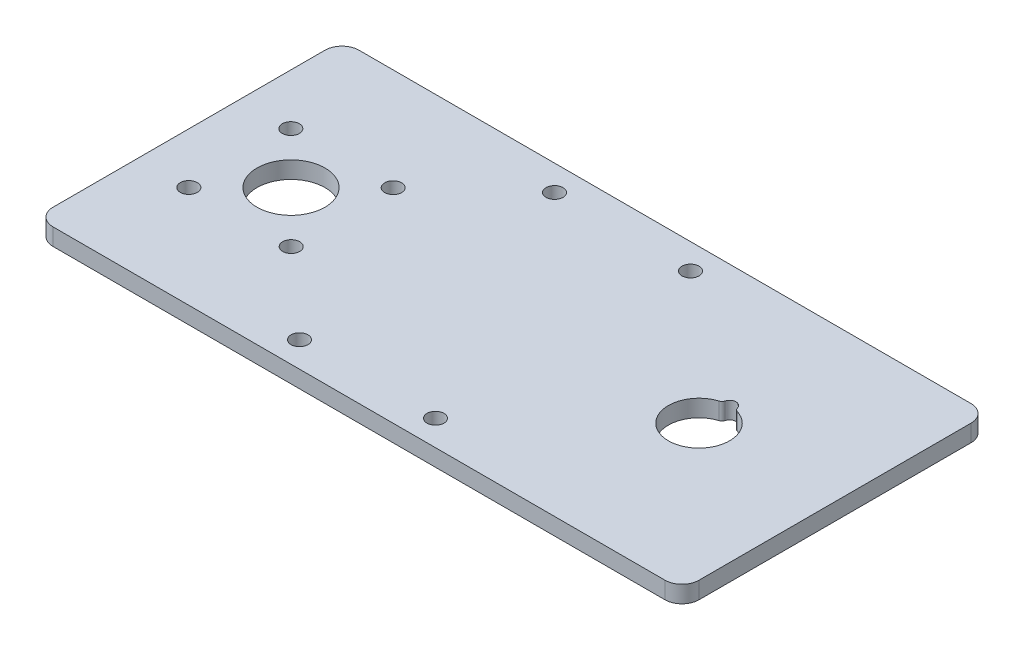
ISO-10303-21;
HEADER;
FILE_DESCRIPTION(('STEP AP214'),'2;1');
FILE_NAME('part.step','',(''),(''),'','','');
FILE_SCHEMA(('AUTOMOTIVE_DESIGN { 1 0 10303 214 1 1 1 1 }'));
ENDSEC;
DATA;
#1=APPLICATION_CONTEXT('core data for automotive mechanical design processes');
#2=APPLICATION_PROTOCOL_DEFINITION('international standard','automotive_design',2000,#1);
#3=PRODUCT_CONTEXT('',#1,'mechanical');
#4=PRODUCT('Part','Part','',(#3));
#5=PRODUCT_RELATED_PRODUCT_CATEGORY('part','',(#4));
#6=PRODUCT_DEFINITION_FORMATION('','',#4);
#7=PRODUCT_DEFINITION_CONTEXT('part definition',#1,'design');
#8=PRODUCT_DEFINITION('design','',#6,#7);
#9=PRODUCT_DEFINITION_SHAPE('','',#8);
#10=(LENGTH_UNIT() NAMED_UNIT(*) SI_UNIT(.MILLI.,.METRE.));
#11=(NAMED_UNIT(*) PLANE_ANGLE_UNIT() SI_UNIT($,.RADIAN.));
#12=(NAMED_UNIT(*) SI_UNIT($,.STERADIAN.) SOLID_ANGLE_UNIT());
#13=UNCERTAINTY_MEASURE_WITH_UNIT(LENGTH_MEASURE(1.E-05),#10,'distance_accuracy_value','');
#14=(GEOMETRIC_REPRESENTATION_CONTEXT(3) GLOBAL_UNCERTAINTY_ASSIGNED_CONTEXT((#13)) GLOBAL_UNIT_ASSIGNED_CONTEXT((#10,
#11,#12)) REPRESENTATION_CONTEXT('',''));
#15=CARTESIAN_POINT('',(0.,0.,0.));
#16=DIRECTION('',(0.,0.,1.));
#17=DIRECTION('',(1.,0.,0.));
#18=AXIS2_PLACEMENT_3D('',#15,#16,#17);
#19=CARTESIAN_POINT('',(0.,6.35,0.));
#20=DIRECTION('',(0.,-1.,0.));
#21=DIRECTION('',(0.,0.,-1.));
#22=AXIS2_PLACEMENT_3D('',#19,#20,#21);
#23=PLANE('',#22);
#24=CARTESIAN_POINT('',(57.2160313938328,6.35,-76.2));
#25=DIRECTION('',(0.,1.,0.));
#26=DIRECTION('',(0.,0.,1.));
#27=AXIS2_PLACEMENT_3D('',#24,#25,#26);
#28=CIRCLE('',#27,3.175);
#29=CARTESIAN_POINT('',(57.2160313938328,6.35,-73.025));
#30=VERTEX_POINT('',#29);
#31=EDGE_CURVE('E257',#30,#30,#28,.T.);
#32=ORIENTED_EDGE('',*,*,#31,.F.);
#33=EDGE_LOOP('',(#32));
#34=FACE_BOUND('',#33,.T.);
#35=CARTESIAN_POINT('',(57.2160313938328,6.35,-38.1));
#36=DIRECTION('',(0.,1.,0.));
#37=DIRECTION('',(0.,0.,1.));
#38=AXIS2_PLACEMENT_3D('',#35,#36,#37);
#39=CIRCLE('',#38,3.175);
#40=CARTESIAN_POINT('',(57.2160313938328,6.35,-34.925));
#41=VERTEX_POINT('',#40);
#42=EDGE_CURVE('E266',#41,#41,#39,.T.);
#43=ORIENTED_EDGE('',*,*,#42,.F.);
#44=EDGE_LOOP('',(#43));
#45=FACE_BOUND('',#44,.T.);
#46=CARTESIAN_POINT('',(18.9839686061672,6.35,-38.1));
#47=DIRECTION('',(0.,1.,0.));
#48=DIRECTION('',(0.,0.,1.));
#49=AXIS2_PLACEMENT_3D('',#46,#47,#48);
#50=CIRCLE('',#49,3.175);
#51=CARTESIAN_POINT('',(18.9839686061672,6.35,-34.925));
#52=VERTEX_POINT('',#51);
#53=EDGE_CURVE('E274',#52,#52,#50,.T.);
#54=ORIENTED_EDGE('',*,*,#53,.F.);
#55=EDGE_LOOP('',(#54));
#56=FACE_BOUND('',#55,.T.);
#57=CARTESIAN_POINT('',(18.9839686061672,6.35,-76.2));
#58=DIRECTION('',(0.,1.,0.));
#59=DIRECTION('',(0.,0.,1.));
#60=AXIS2_PLACEMENT_3D('',#57,#58,#59);
#61=CIRCLE('',#60,3.175);
#62=CARTESIAN_POINT('',(18.9839686061672,6.35,-73.025));
#63=VERTEX_POINT('',#62);
#64=EDGE_CURVE('E282',#63,#63,#61,.T.);
#65=ORIENTED_EDGE('',*,*,#64,.F.);
#66=EDGE_LOOP('',(#65));
#67=FACE_BOUND('',#66,.T.);
#68=CARTESIAN_POINT('',(88.9,6.35,-9.525));
#69=DIRECTION('',(0.,1.,0.));
#70=DIRECTION('',(0.,0.,1.));
#71=AXIS2_PLACEMENT_3D('',#68,#69,#70);
#72=CIRCLE('',#71,3.175);
#73=CARTESIAN_POINT('',(88.9,6.35,-6.35));
#74=VERTEX_POINT('',#73);
#75=EDGE_CURVE('E290',#74,#74,#72,.T.);
#76=ORIENTED_EDGE('',*,*,#75,.F.);
#77=EDGE_LOOP('',(#76));
#78=FACE_BOUND('',#77,.T.);
#79=CARTESIAN_POINT('',(139.7,6.35,-9.525));
#80=DIRECTION('',(0.,1.,0.));
#81=DIRECTION('',(0.,0.,1.));
#82=AXIS2_PLACEMENT_3D('',#79,#80,#81);
#83=CIRCLE('',#82,3.175);
#84=CARTESIAN_POINT('',(139.7,6.35,-6.35));
#85=VERTEX_POINT('',#84);
#86=EDGE_CURVE('E298',#85,#85,#83,.T.);
#87=ORIENTED_EDGE('',*,*,#86,.F.);
#88=EDGE_LOOP('',(#87));
#89=FACE_BOUND('',#88,.T.);
#90=CARTESIAN_POINT('',(139.7,6.35,-104.775));
#91=DIRECTION('',(0.,1.,0.));
#92=DIRECTION('',(0.,0.,1.));
#93=AXIS2_PLACEMENT_3D('',#90,#91,#92);
#94=CIRCLE('',#93,3.17499999999997);
#95=CARTESIAN_POINT('',(139.7,6.35,-101.6));
#96=VERTEX_POINT('',#95);
#97=EDGE_CURVE('E306',#96,#96,#94,.T.);
#98=ORIENTED_EDGE('',*,*,#97,.F.);
#99=EDGE_LOOP('',(#98));
#100=FACE_BOUND('',#99,.T.);
#101=CARTESIAN_POINT('',(88.9,6.35,-104.775));
#102=DIRECTION('',(0.,1.,0.));
#103=DIRECTION('',(0.,0.,1.));
#104=AXIS2_PLACEMENT_3D('',#101,#102,#103);
#105=CIRCLE('',#104,3.175);
#106=CARTESIAN_POINT('',(88.9,6.35,-101.6));
#107=VERTEX_POINT('',#106);
#108=EDGE_CURVE('E314',#107,#107,#105,.T.);
#109=ORIENTED_EDGE('',*,*,#108,.F.);
#110=EDGE_LOOP('',(#109));
#111=FACE_BOUND('',#110,.T.);
#112=CARTESIAN_POINT('',(38.1,6.35,-57.15));
#113=DIRECTION('',(0.,1.,0.));
#114=DIRECTION('',(0.,0.,1.));
#115=AXIS2_PLACEMENT_3D('',#112,#113,#114);
#116=CIRCLE('',#115,12.7);
#117=CARTESIAN_POINT('',(38.1,6.35,-44.45));
#118=VERTEX_POINT('',#117);
#119=EDGE_CURVE('E162',#118,#118,#116,.T.);
#120=ORIENTED_EDGE('',*,*,#119,.F.);
#121=EDGE_LOOP('',(#120));
#122=FACE_BOUND('',#121,.T.);
#123=DIRECTION('',(-1.,0.,0.));
#124=VECTOR('',#123,1.);
#125=CARTESIAN_POINT('',(0.,6.35,-114.3));
#126=LINE('',#125,#124);
#127=CARTESIAN_POINT('',(234.95,6.35,-114.3));
#128=VERTEX_POINT('',#127);
#129=CARTESIAN_POINT('',(6.35,6.35,-114.3));
#130=VERTEX_POINT('',#129);
#131=EDGE_CURVE('E174',#128,#130,#126,.T.);
#132=ORIENTED_EDGE('',*,*,#131,.T.);
#133=CARTESIAN_POINT('',(6.35,6.35,-107.95));
#134=DIRECTION('',(0.,-1.,0.));
#135=DIRECTION('',(0.,0.,-1.));
#136=AXIS2_PLACEMENT_3D('',#133,#134,#135);
#137=CIRCLE('',#136,6.35);
#138=CARTESIAN_POINT('',(0.,6.35,-107.95));
#139=VERTEX_POINT('',#138);
#140=EDGE_CURVE('E206',#130,#139,#137,.F.);
#141=ORIENTED_EDGE('',*,*,#140,.T.);
#142=DIRECTION('',(0.,0.,1.));
#143=VECTOR('',#142,1.);
#144=CARTESIAN_POINT('',(0.,6.35,0.));
#145=LINE('',#144,#143);
#146=CARTESIAN_POINT('',(0.,6.35,-6.35));
#147=VERTEX_POINT('',#146);
#148=EDGE_CURVE('E152',#139,#147,#145,.T.);
#149=ORIENTED_EDGE('',*,*,#148,.T.);
#150=CARTESIAN_POINT('',(6.35,6.35,-6.35));
#151=DIRECTION('',(0.,-1.,0.));
#152=DIRECTION('',(0.,0.,-1.));
#153=AXIS2_PLACEMENT_3D('',#150,#151,#152);
#154=CIRCLE('',#153,6.35);
#155=CARTESIAN_POINT('',(6.35,6.35,0.));
#156=VERTEX_POINT('',#155);
#157=EDGE_CURVE('E197',#147,#156,#154,.F.);
#158=ORIENTED_EDGE('',*,*,#157,.T.);
#159=DIRECTION('',(1.,0.,0.));
#160=VECTOR('',#159,1.);
#161=CARTESIAN_POINT('',(0.,6.35,0.));
#162=LINE('',#161,#160);
#163=CARTESIAN_POINT('',(234.95,6.35,0.));
#164=VERTEX_POINT('',#163);
#165=EDGE_CURVE('E326',#156,#164,#162,.T.);
#166=ORIENTED_EDGE('',*,*,#165,.T.);
#167=CARTESIAN_POINT('',(234.95,6.35,-6.35));
#168=DIRECTION('',(0.,-1.,0.));
#169=DIRECTION('',(0.,0.,-1.));
#170=AXIS2_PLACEMENT_3D('',#167,#168,#169);
#171=CIRCLE('',#170,6.35);
#172=CARTESIAN_POINT('',(241.3,6.35,-6.35));
#173=VERTEX_POINT('',#172);
#174=EDGE_CURVE('E200',#164,#173,#171,.F.);
#175=ORIENTED_EDGE('',*,*,#174,.T.);
#176=DIRECTION('',(0.,0.,-1.));
#177=VECTOR('',#176,1.);
#178=CARTESIAN_POINT('',(241.3,6.35,0.));
#179=LINE('',#178,#177);
#180=CARTESIAN_POINT('',(241.3,6.35,-107.95));
#181=VERTEX_POINT('',#180);
#182=EDGE_CURVE('E329',#173,#181,#179,.T.);
#183=ORIENTED_EDGE('',*,*,#182,.T.);
#184=CARTESIAN_POINT('',(234.95,6.35,-107.95));
#185=DIRECTION('',(0.,-1.,0.));
#186=DIRECTION('',(0.,0.,-1.));
#187=AXIS2_PLACEMENT_3D('',#184,#185,#186);
#188=CIRCLE('',#187,6.35);
#189=EDGE_CURVE('E203',#181,#128,#188,.F.);
#190=ORIENTED_EDGE('',*,*,#189,.T.);
#191=EDGE_LOOP('',(#132,#141,#149,#158,#166,#175,#183,#190));
#192=FACE_BOUND('',#191,.T.);
#193=CARTESIAN_POINT('',(190.5,6.35,-57.15));
#194=DIRECTION('',(0.,1.,0.));
#195=DIRECTION('',(0.,0.,1.));
#196=AXIS2_PLACEMENT_3D('',#193,#194,#195);
#197=CIRCLE('',#196,11.43);
#198=CARTESIAN_POINT('',(187.129681779469,6.35,-68.071806402439));
#199=VERTEX_POINT('',#198);
#200=CARTESIAN_POINT('',(193.870318220531,6.35,-68.071806402439));
#201=VERTEX_POINT('',#200);
#202=EDGE_CURVE('E239',#199,#201,#197,.T.);
#203=ORIENTED_EDGE('',*,*,#202,.F.);
#204=CARTESIAN_POINT('',(186.661582026618,6.35,-69.5887239583333));
#205=DIRECTION('',(0.,-1.,0.));
#206=DIRECTION('',(0.,0.,-1.));
#207=AXIS2_PLACEMENT_3D('',#204,#205,#206);
#208=CIRCLE('',#207,1.5875);
#209=CARTESIAN_POINT('',(188.196949215971,6.35,-69.185234375));
#210=VERTEX_POINT('',#209);
#211=EDGE_CURVE('E11',#199,#210,#208,.F.);
#212=ORIENTED_EDGE('',*,*,#211,.T.);
#213=CARTESIAN_POINT('',(190.5,6.35,-68.58));
#214=DIRECTION('',(0.,1.,0.));
#215=DIRECTION('',(0.,0.,1.));
#216=AXIS2_PLACEMENT_3D('',#213,#214,#215);
#217=CIRCLE('',#216,2.38125);
#218=CARTESIAN_POINT('',(192.803050784029,6.35,-69.185234375));
#219=VERTEX_POINT('',#218);
#220=EDGE_CURVE('E245',#219,#210,#217,.T.);
#221=ORIENTED_EDGE('',*,*,#220,.F.);
#222=CARTESIAN_POINT('',(194.338417973382,6.35,-69.5887239583333));
#223=DIRECTION('',(0.,-1.,0.));
#224=DIRECTION('',(0.,0.,-1.));
#225=AXIS2_PLACEMENT_3D('',#222,#223,#224);
#226=CIRCLE('',#225,1.5875);
#227=EDGE_CURVE('E50',#219,#201,#226,.F.);
#228=ORIENTED_EDGE('',*,*,#227,.T.);
#229=EDGE_LOOP('',(#203,#212,#221,#228));
#230=FACE_BOUND('',#229,.T.);
#231=ADVANCED_FACE('F42',(#34,#45,#56,#67,#78,#89,#100,#111,#122,#192,#230),#23,.F.);
#232=CARTESIAN_POINT('',(0.,0.,0.));
#233=DIRECTION('',(0.,-1.,0.));
#234=DIRECTION('',(0.,0.,-1.));
#235=AXIS2_PLACEMENT_3D('',#232,#233,#234);
#236=PLANE('',#235);
#237=CARTESIAN_POINT('',(57.2160313938328,0.,-38.1));
#238=DIRECTION('',(0.,1.,0.));
#239=DIRECTION('',(0.,0.,1.));
#240=AXIS2_PLACEMENT_3D('',#237,#238,#239);
#241=CIRCLE('',#240,3.175);
#242=CARTESIAN_POINT('',(57.2160313938328,0.,-34.925));
#243=VERTEX_POINT('',#242);
#244=EDGE_CURVE('E261',#243,#243,#241,.T.);
#245=ORIENTED_EDGE('',*,*,#244,.T.);
#246=EDGE_LOOP('',(#245));
#247=FACE_BOUND('',#246,.T.);
#248=CARTESIAN_POINT('',(18.9839686061672,0.,-76.2));
#249=DIRECTION('',(0.,1.,0.));
#250=DIRECTION('',(0.,0.,1.));
#251=AXIS2_PLACEMENT_3D('',#248,#249,#250);
#252=CIRCLE('',#251,3.175);
#253=CARTESIAN_POINT('',(18.9839686061672,0.,-73.025));
#254=VERTEX_POINT('',#253);
#255=EDGE_CURVE('E278',#254,#254,#252,.T.);
#256=ORIENTED_EDGE('',*,*,#255,.T.);
#257=EDGE_LOOP('',(#256));
#258=FACE_BOUND('',#257,.T.);
#259=CARTESIAN_POINT('',(139.7,0.,-9.525));
#260=DIRECTION('',(0.,1.,0.));
#261=DIRECTION('',(0.,0.,1.));
#262=AXIS2_PLACEMENT_3D('',#259,#260,#261);
#263=CIRCLE('',#262,3.175);
#264=CARTESIAN_POINT('',(139.7,0.,-6.35));
#265=VERTEX_POINT('',#264);
#266=EDGE_CURVE('E294',#265,#265,#263,.T.);
#267=ORIENTED_EDGE('',*,*,#266,.T.);
#268=EDGE_LOOP('',(#267));
#269=FACE_BOUND('',#268,.T.);
#270=CARTESIAN_POINT('',(88.9,0.,-104.775));
#271=DIRECTION('',(0.,1.,0.));
#272=DIRECTION('',(0.,0.,1.));
#273=AXIS2_PLACEMENT_3D('',#270,#271,#272);
#274=CIRCLE('',#273,3.175);
#275=CARTESIAN_POINT('',(88.9,0.,-101.6));
#276=VERTEX_POINT('',#275);
#277=EDGE_CURVE('E310',#276,#276,#274,.T.);
#278=ORIENTED_EDGE('',*,*,#277,.T.);
#279=EDGE_LOOP('',(#278));
#280=FACE_BOUND('',#279,.T.);
#281=DIRECTION('',(0.,0.,1.));
#282=VECTOR('',#281,1.);
#283=CARTESIAN_POINT('',(0.,0.,0.));
#284=LINE('',#283,#282);
#285=CARTESIAN_POINT('',(0.,0.,-107.95));
#286=VERTEX_POINT('',#285);
#287=CARTESIAN_POINT('',(0.,0.,-6.35));
#288=VERTEX_POINT('',#287);
#289=EDGE_CURVE('E149',#286,#288,#284,.T.);
#290=ORIENTED_EDGE('',*,*,#289,.F.);
#291=CARTESIAN_POINT('',(6.35,0.,-107.95));
#292=DIRECTION('',(0.,-1.,0.));
#293=DIRECTION('',(0.,0.,-1.));
#294=AXIS2_PLACEMENT_3D('',#291,#292,#293);
#295=CIRCLE('',#294,6.35);
#296=CARTESIAN_POINT('',(6.35,0.,-114.3));
#297=VERTEX_POINT('',#296);
#298=EDGE_CURVE('E131',#286,#297,#295,.T.);
#299=ORIENTED_EDGE('',*,*,#298,.T.);
#300=DIRECTION('',(-1.,0.,0.));
#301=VECTOR('',#300,1.);
#302=CARTESIAN_POINT('',(0.,0.,-114.3));
#303=LINE('',#302,#301);
#304=CARTESIAN_POINT('',(234.95,0.,-114.3));
#305=VERTEX_POINT('',#304);
#306=EDGE_CURVE('E180',#305,#297,#303,.T.);
#307=ORIENTED_EDGE('',*,*,#306,.F.);
#308=CARTESIAN_POINT('',(234.95,0.,-107.95));
#309=DIRECTION('',(0.,-1.,0.));
#310=DIRECTION('',(0.,0.,-1.));
#311=AXIS2_PLACEMENT_3D('',#308,#309,#310);
#312=CIRCLE('',#311,6.35);
#313=CARTESIAN_POINT('',(241.3,0.,-107.95));
#314=VERTEX_POINT('',#313);
#315=EDGE_CURVE('E143',#305,#314,#312,.T.);
#316=ORIENTED_EDGE('',*,*,#315,.T.);
#317=DIRECTION('',(0.,0.,-1.));
#318=VECTOR('',#317,1.);
#319=CARTESIAN_POINT('',(241.3,0.,0.));
#320=LINE('',#319,#318);
#321=CARTESIAN_POINT('',(241.3,0.,-6.35));
#322=VERTEX_POINT('',#321);
#323=EDGE_CURVE('E168',#322,#314,#320,.T.);
#324=ORIENTED_EDGE('',*,*,#323,.F.);
#325=CARTESIAN_POINT('',(234.95,0.,-6.35));
#326=DIRECTION('',(0.,-1.,0.));
#327=DIRECTION('',(0.,0.,-1.));
#328=AXIS2_PLACEMENT_3D('',#325,#326,#327);
#329=CIRCLE('',#328,6.35);
#330=CARTESIAN_POINT('',(234.95,0.,0.));
#331=VERTEX_POINT('',#330);
#332=EDGE_CURVE('E187',#322,#331,#329,.T.);
#333=ORIENTED_EDGE('',*,*,#332,.T.);
#334=DIRECTION('',(1.,0.,0.));
#335=VECTOR('',#334,1.);
#336=CARTESIAN_POINT('',(0.,0.,0.));
#337=LINE('',#336,#335);
#338=CARTESIAN_POINT('',(6.35,0.,0.));
#339=VERTEX_POINT('',#338);
#340=EDGE_CURVE('E161',#339,#331,#337,.T.);
#341=ORIENTED_EDGE('',*,*,#340,.F.);
#342=CARTESIAN_POINT('',(6.35,0.,-6.35));
#343=DIRECTION('',(0.,-1.,0.));
#344=DIRECTION('',(0.,0.,-1.));
#345=AXIS2_PLACEMENT_3D('',#342,#343,#344);
#346=CIRCLE('',#345,6.35);
#347=EDGE_CURVE('E154',#339,#288,#346,.T.);
#348=ORIENTED_EDGE('',*,*,#347,.T.);
#349=EDGE_LOOP('',(#290,#299,#307,#316,#324,#333,#341,#348));
#350=FACE_BOUND('',#349,.T.);
#351=CARTESIAN_POINT('',(38.1,0.,-57.15));
#352=DIRECTION('',(0.,1.,0.));
#353=DIRECTION('',(0.,0.,1.));
#354=AXIS2_PLACEMENT_3D('',#351,#352,#353);
#355=CIRCLE('',#354,12.7);
#356=CARTESIAN_POINT('',(38.1,0.,-44.45));
#357=VERTEX_POINT('',#356);
#358=EDGE_CURVE('E171',#357,#357,#355,.T.);
#359=ORIENTED_EDGE('',*,*,#358,.T.);
#360=EDGE_LOOP('',(#359));
#361=FACE_BOUND('',#360,.T.);
#362=CARTESIAN_POINT('',(139.7,0.,-104.775));
#363=DIRECTION('',(0.,1.,0.));
#364=DIRECTION('',(0.,0.,1.));
#365=AXIS2_PLACEMENT_3D('',#362,#363,#364);
#366=CIRCLE('',#365,3.17499999999997);
#367=CARTESIAN_POINT('',(139.7,0.,-101.6));
#368=VERTEX_POINT('',#367);
#369=EDGE_CURVE('E302',#368,#368,#366,.T.);
#370=ORIENTED_EDGE('',*,*,#369,.T.);
#371=EDGE_LOOP('',(#370));
#372=FACE_BOUND('',#371,.T.);
#373=CARTESIAN_POINT('',(88.9,0.,-9.525));
#374=DIRECTION('',(0.,1.,0.));
#375=DIRECTION('',(0.,0.,1.));
#376=AXIS2_PLACEMENT_3D('',#373,#374,#375);
#377=CIRCLE('',#376,3.175);
#378=CARTESIAN_POINT('',(88.9,0.,-6.35));
#379=VERTEX_POINT('',#378);
#380=EDGE_CURVE('E286',#379,#379,#377,.T.);
#381=ORIENTED_EDGE('',*,*,#380,.T.);
#382=EDGE_LOOP('',(#381));
#383=FACE_BOUND('',#382,.T.);
#384=CARTESIAN_POINT('',(18.9839686061672,0.,-38.1));
#385=DIRECTION('',(0.,1.,0.));
#386=DIRECTION('',(0.,0.,1.));
#387=AXIS2_PLACEMENT_3D('',#384,#385,#386);
#388=CIRCLE('',#387,3.175);
#389=CARTESIAN_POINT('',(18.9839686061672,0.,-34.925));
#390=VERTEX_POINT('',#389);
#391=EDGE_CURVE('E270',#390,#390,#388,.T.);
#392=ORIENTED_EDGE('',*,*,#391,.T.);
#393=EDGE_LOOP('',(#392));
#394=FACE_BOUND('',#393,.T.);
#395=CARTESIAN_POINT('',(57.2160313938328,0.,-76.2));
#396=DIRECTION('',(0.,1.,0.));
#397=DIRECTION('',(0.,0.,1.));
#398=AXIS2_PLACEMENT_3D('',#395,#396,#397);
#399=CIRCLE('',#398,3.175);
#400=CARTESIAN_POINT('',(57.2160313938328,0.,-73.025));
#401=VERTEX_POINT('',#400);
#402=EDGE_CURVE('E262',#401,#401,#399,.T.);
#403=ORIENTED_EDGE('',*,*,#402,.T.);
#404=EDGE_LOOP('',(#403));
#405=FACE_BOUND('',#404,.T.);
#406=CARTESIAN_POINT('',(190.5,0.,-68.58));
#407=DIRECTION('',(0.,1.,0.));
#408=DIRECTION('',(0.,0.,1.));
#409=AXIS2_PLACEMENT_3D('',#406,#407,#408);
#410=CIRCLE('',#409,2.38125);
#411=CARTESIAN_POINT('',(192.803050784029,0.,-69.185234375));
#412=VERTEX_POINT('',#411);
#413=CARTESIAN_POINT('',(188.196949215971,0.,-69.185234375));
#414=VERTEX_POINT('',#413);
#415=EDGE_CURVE('E246',#412,#414,#410,.T.);
#416=ORIENTED_EDGE('',*,*,#415,.T.);
#417=CARTESIAN_POINT('',(186.661582026618,0.,-69.5887239583333));
#418=DIRECTION('',(0.,-1.,0.));
#419=DIRECTION('',(0.,0.,-1.));
#420=AXIS2_PLACEMENT_3D('',#417,#418,#419);
#421=CIRCLE('',#420,1.5875);
#422=CARTESIAN_POINT('',(187.129681779469,0.,-68.071806402439));
#423=VERTEX_POINT('',#422);
#424=EDGE_CURVE('E230',#414,#423,#421,.T.);
#425=ORIENTED_EDGE('',*,*,#424,.T.);
#426=CARTESIAN_POINT('',(190.5,0.,-57.15));
#427=DIRECTION('',(0.,1.,0.));
#428=DIRECTION('',(0.,0.,1.));
#429=AXIS2_PLACEMENT_3D('',#426,#427,#428);
#430=CIRCLE('',#429,11.43);
#431=CARTESIAN_POINT('',(193.870318220531,0.,-68.071806402439));
#432=VERTEX_POINT('',#431);
#433=EDGE_CURVE('E238',#423,#432,#430,.T.);
#434=ORIENTED_EDGE('',*,*,#433,.T.);
#435=CARTESIAN_POINT('',(194.338417973382,0.,-69.5887239583333));
#436=DIRECTION('',(0.,-1.,0.));
#437=DIRECTION('',(0.,0.,-1.));
#438=AXIS2_PLACEMENT_3D('',#435,#436,#437);
#439=CIRCLE('',#438,1.5875);
#440=EDGE_CURVE('E228',#432,#412,#439,.T.);
#441=ORIENTED_EDGE('',*,*,#440,.T.);
#442=EDGE_LOOP('',(#416,#425,#434,#441));
#443=FACE_BOUND('',#442,.T.);
#444=ADVANCED_FACE('F157',(#247,#258,#269,#280,#350,#361,#372,#383,#394,#405,#443),#236,.T.);
#445=CARTESIAN_POINT('',(0.,6.35,0.));
#446=DIRECTION('',(1.,0.,0.));
#447=DIRECTION('',(0.,0.,-1.));
#448=AXIS2_PLACEMENT_3D('',#445,#446,#447);
#449=PLANE('',#448);
#450=ORIENTED_EDGE('',*,*,#148,.F.);
#451=DIRECTION('',(0.,-1.,0.));
#452=VECTOR('',#451,1.);
#453=CARTESIAN_POINT('',(0.,6.35,-107.95));
#454=LINE('',#453,#452);
#455=EDGE_CURVE('E135',#139,#286,#454,.T.);
#456=ORIENTED_EDGE('',*,*,#455,.T.);
#457=ORIENTED_EDGE('',*,*,#289,.T.);
#458=DIRECTION('',(0.,-1.,0.));
#459=VECTOR('',#458,1.);
#460=CARTESIAN_POINT('',(0.,6.35,-6.35));
#461=LINE('',#460,#459);
#462=EDGE_CURVE('E155',#288,#147,#461,.F.);
#463=ORIENTED_EDGE('',*,*,#462,.T.);
#464=EDGE_LOOP('',(#450,#456,#457,#463));
#465=FACE_BOUND('',#464,.T.);
#466=ADVANCED_FACE('F148',(#465),#449,.F.);
#467=CARTESIAN_POINT('',(0.,6.35,0.));
#468=DIRECTION('',(0.,0.,-1.));
#469=DIRECTION('',(-1.,0.,0.));
#470=AXIS2_PLACEMENT_3D('',#467,#468,#469);
#471=PLANE('',#470);
#472=ORIENTED_EDGE('',*,*,#340,.T.);
#473=DIRECTION('',(0.,-1.,0.));
#474=VECTOR('',#473,1.);
#475=CARTESIAN_POINT('',(234.95,6.35,0.));
#476=LINE('',#475,#474);
#477=EDGE_CURVE('E220',#331,#164,#476,.F.);
#478=ORIENTED_EDGE('',*,*,#477,.T.);
#479=ORIENTED_EDGE('',*,*,#165,.F.);
#480=DIRECTION('',(0.,-1.,0.));
#481=VECTOR('',#480,1.);
#482=CARTESIAN_POINT('',(6.35,6.35,0.));
#483=LINE('',#482,#481);
#484=EDGE_CURVE('E216',#156,#339,#483,.T.);
#485=ORIENTED_EDGE('',*,*,#484,.T.);
#486=EDGE_LOOP('',(#472,#478,#479,#485));
#487=FACE_BOUND('',#486,.T.);
#488=ADVANCED_FACE('F355',(#487),#471,.F.);
#489=CARTESIAN_POINT('',(241.3,6.35,0.));
#490=DIRECTION('',(-1.,0.,0.));
#491=DIRECTION('',(0.,0.,1.));
#492=AXIS2_PLACEMENT_3D('',#489,#490,#491);
#493=PLANE('',#492);
#494=ORIENTED_EDGE('',*,*,#323,.T.);
#495=DIRECTION('',(0.,-1.,0.));
#496=VECTOR('',#495,1.);
#497=CARTESIAN_POINT('',(241.3,6.35,-107.95));
#498=LINE('',#497,#496);
#499=EDGE_CURVE('E213',#314,#181,#498,.F.);
#500=ORIENTED_EDGE('',*,*,#499,.T.);
#501=ORIENTED_EDGE('',*,*,#182,.F.);
#502=DIRECTION('',(0.,-1.,0.));
#503=VECTOR('',#502,1.);
#504=CARTESIAN_POINT('',(241.3,6.35,-6.35));
#505=LINE('',#504,#503);
#506=EDGE_CURVE('E209',#173,#322,#505,.T.);
#507=ORIENTED_EDGE('',*,*,#506,.T.);
#508=EDGE_LOOP('',(#494,#500,#501,#507));
#509=FACE_BOUND('',#508,.T.);
#510=ADVANCED_FACE('F348',(#509),#493,.F.);
#511=CARTESIAN_POINT('',(0.,6.35,-114.3));
#512=DIRECTION('',(0.,0.,1.));
#513=DIRECTION('',(1.,0.,0.));
#514=AXIS2_PLACEMENT_3D('',#511,#512,#513);
#515=PLANE('',#514);
#516=ORIENTED_EDGE('',*,*,#306,.T.);
#517=DIRECTION('',(0.,-1.,0.));
#518=VECTOR('',#517,1.);
#519=CARTESIAN_POINT('',(6.35,6.35,-114.3));
#520=LINE('',#519,#518);
#521=EDGE_CURVE('E136',#297,#130,#520,.F.);
#522=ORIENTED_EDGE('',*,*,#521,.T.);
#523=ORIENTED_EDGE('',*,*,#131,.F.);
#524=DIRECTION('',(0.,-1.,0.));
#525=VECTOR('',#524,1.);
#526=CARTESIAN_POINT('',(234.95,6.35,-114.3));
#527=LINE('',#526,#525);
#528=EDGE_CURVE('E142',#128,#305,#527,.T.);
#529=ORIENTED_EDGE('',*,*,#528,.T.);
#530=EDGE_LOOP('',(#516,#522,#523,#529));
#531=FACE_BOUND('',#530,.T.);
#532=ADVANCED_FACE('F342',(#531),#515,.F.);
#533=CARTESIAN_POINT('',(38.1,6.35,-57.15));
#534=DIRECTION('',(0.,-1.,0.));
#535=DIRECTION('',(0.,0.,-1.));
#536=AXIS2_PLACEMENT_3D('',#533,#534,#535);
#537=CYLINDRICAL_SURFACE('',#536,12.7);
#538=ORIENTED_EDGE('',*,*,#119,.T.);
#539=EDGE_LOOP('',(#538));
#540=FACE_BOUND('',#539,.T.);
#541=ORIENTED_EDGE('',*,*,#358,.F.);
#542=EDGE_LOOP('',(#541));
#543=FACE_BOUND('',#542,.T.);
#544=ADVANCED_FACE('F381',(#540,#543),#537,.F.);
#545=CARTESIAN_POINT('',(88.9,6.35,-104.775));
#546=DIRECTION('',(0.,-1.,0.));
#547=DIRECTION('',(0.,0.,-1.));
#548=AXIS2_PLACEMENT_3D('',#545,#546,#547);
#549=CYLINDRICAL_SURFACE('',#548,3.175);
#550=ORIENTED_EDGE('',*,*,#108,.T.);
#551=EDGE_LOOP('',(#550));
#552=FACE_BOUND('',#551,.T.);
#553=ORIENTED_EDGE('',*,*,#277,.F.);
#554=EDGE_LOOP('',(#553));
#555=FACE_BOUND('',#554,.T.);
#556=ADVANCED_FACE('F575',(#552,#555),#549,.F.);
#557=CARTESIAN_POINT('',(139.7,6.35,-104.775));
#558=DIRECTION('',(0.,-1.,0.));
#559=DIRECTION('',(0.,0.,-1.));
#560=AXIS2_PLACEMENT_3D('',#557,#558,#559);
#561=CYLINDRICAL_SURFACE('',#560,3.17499999999997);
#562=ORIENTED_EDGE('',*,*,#97,.T.);
#563=EDGE_LOOP('',(#562));
#564=FACE_BOUND('',#563,.T.);
#565=ORIENTED_EDGE('',*,*,#369,.F.);
#566=EDGE_LOOP('',(#565));
#567=FACE_BOUND('',#566,.T.);
#568=ADVANCED_FACE('F564',(#564,#567),#561,.F.);
#569=CARTESIAN_POINT('',(139.7,6.35,-9.525));
#570=DIRECTION('',(0.,-1.,0.));
#571=DIRECTION('',(0.,0.,-1.));
#572=AXIS2_PLACEMENT_3D('',#569,#570,#571);
#573=CYLINDRICAL_SURFACE('',#572,3.175);
#574=ORIENTED_EDGE('',*,*,#86,.T.);
#575=EDGE_LOOP('',(#574));
#576=FACE_BOUND('',#575,.T.);
#577=ORIENTED_EDGE('',*,*,#266,.F.);
#578=EDGE_LOOP('',(#577));
#579=FACE_BOUND('',#578,.T.);
#580=ADVANCED_FACE('F553',(#576,#579),#573,.F.);
#581=CARTESIAN_POINT('',(88.9,6.35,-9.525));
#582=DIRECTION('',(0.,-1.,0.));
#583=DIRECTION('',(0.,0.,-1.));
#584=AXIS2_PLACEMENT_3D('',#581,#582,#583);
#585=CYLINDRICAL_SURFACE('',#584,3.175);
#586=ORIENTED_EDGE('',*,*,#75,.T.);
#587=EDGE_LOOP('',(#586));
#588=FACE_BOUND('',#587,.T.);
#589=ORIENTED_EDGE('',*,*,#380,.F.);
#590=EDGE_LOOP('',(#589));
#591=FACE_BOUND('',#590,.T.);
#592=ADVANCED_FACE('F542',(#588,#591),#585,.F.);
#593=CARTESIAN_POINT('',(18.9839686061672,6.35,-76.2));
#594=DIRECTION('',(0.,-1.,0.));
#595=DIRECTION('',(0.,0.,-1.));
#596=AXIS2_PLACEMENT_3D('',#593,#594,#595);
#597=CYLINDRICAL_SURFACE('',#596,3.175);
#598=ORIENTED_EDGE('',*,*,#64,.T.);
#599=EDGE_LOOP('',(#598));
#600=FACE_BOUND('',#599,.T.);
#601=ORIENTED_EDGE('',*,*,#255,.F.);
#602=EDGE_LOOP('',(#601));
#603=FACE_BOUND('',#602,.T.);
#604=ADVANCED_FACE('F531',(#600,#603),#597,.F.);
#605=CARTESIAN_POINT('',(18.9839686061672,6.35,-38.1));
#606=DIRECTION('',(0.,-1.,0.));
#607=DIRECTION('',(0.,0.,-1.));
#608=AXIS2_PLACEMENT_3D('',#605,#606,#607);
#609=CYLINDRICAL_SURFACE('',#608,3.175);
#610=ORIENTED_EDGE('',*,*,#53,.T.);
#611=EDGE_LOOP('',(#610));
#612=FACE_BOUND('',#611,.T.);
#613=ORIENTED_EDGE('',*,*,#391,.F.);
#614=EDGE_LOOP('',(#613));
#615=FACE_BOUND('',#614,.T.);
#616=ADVANCED_FACE('F520',(#612,#615),#609,.F.);
#617=CARTESIAN_POINT('',(57.2160313938328,6.35,-38.1));
#618=DIRECTION('',(0.,-1.,0.));
#619=DIRECTION('',(0.,0.,-1.));
#620=AXIS2_PLACEMENT_3D('',#617,#618,#619);
#621=CYLINDRICAL_SURFACE('',#620,3.175);
#622=ORIENTED_EDGE('',*,*,#42,.T.);
#623=EDGE_LOOP('',(#622));
#624=FACE_BOUND('',#623,.T.);
#625=ORIENTED_EDGE('',*,*,#244,.F.);
#626=EDGE_LOOP('',(#625));
#627=FACE_BOUND('',#626,.T.);
#628=ADVANCED_FACE('F509',(#624,#627),#621,.F.);
#629=CARTESIAN_POINT('',(57.2160313938328,6.35,-76.2));
#630=DIRECTION('',(0.,-1.,0.));
#631=DIRECTION('',(0.,0.,-1.));
#632=AXIS2_PLACEMENT_3D('',#629,#630,#631);
#633=CYLINDRICAL_SURFACE('',#632,3.175);
#634=ORIENTED_EDGE('',*,*,#31,.T.);
#635=EDGE_LOOP('',(#634));
#636=FACE_BOUND('',#635,.T.);
#637=ORIENTED_EDGE('',*,*,#402,.F.);
#638=EDGE_LOOP('',(#637));
#639=FACE_BOUND('',#638,.T.);
#640=ADVANCED_FACE('F432',(#636,#639),#633,.F.);
#641=CARTESIAN_POINT('',(190.5,6.35,-68.58));
#642=DIRECTION('',(0.,-1.,0.));
#643=DIRECTION('',(0.,0.,-1.));
#644=AXIS2_PLACEMENT_3D('',#641,#642,#643);
#645=CYLINDRICAL_SURFACE('',#644,2.38125);
#646=ORIENTED_EDGE('',*,*,#220,.T.);
#647=DIRECTION('',(0.,-1.,0.));
#648=VECTOR('',#647,1.);
#649=CARTESIAN_POINT('',(188.196949215971,6.35,-69.185234375));
#650=LINE('',#649,#648);
#651=EDGE_CURVE('E225',#210,#414,#650,.T.);
#652=ORIENTED_EDGE('',*,*,#651,.T.);
#653=ORIENTED_EDGE('',*,*,#415,.F.);
#654=DIRECTION('',(0.,-1.,0.));
#655=VECTOR('',#654,1.);
#656=CARTESIAN_POINT('',(192.803050784029,6.35,-69.185234375));
#657=LINE('',#656,#655);
#658=EDGE_CURVE('E223',#412,#219,#657,.F.);
#659=ORIENTED_EDGE('',*,*,#658,.T.);
#660=EDGE_LOOP('',(#646,#652,#653,#659));
#661=FACE_BOUND('',#660,.T.);
#662=ADVANCED_FACE('F427',(#661),#645,.F.);
#663=CARTESIAN_POINT('',(190.5,6.35,-57.15));
#664=DIRECTION('',(0.,-1.,0.));
#665=DIRECTION('',(0.,0.,-1.));
#666=AXIS2_PLACEMENT_3D('',#663,#664,#665);
#667=CYLINDRICAL_SURFACE('',#666,11.43);
#668=ORIENTED_EDGE('',*,*,#433,.F.);
#669=DIRECTION('',(0.,-1.,0.));
#670=VECTOR('',#669,1.);
#671=CARTESIAN_POINT('',(187.129681779469,6.35,-68.071806402439));
#672=LINE('',#671,#670);
#673=EDGE_CURVE('E63',#423,#199,#672,.F.);
#674=ORIENTED_EDGE('',*,*,#673,.T.);
#675=ORIENTED_EDGE('',*,*,#202,.T.);
#676=DIRECTION('',(0.,-1.,0.));
#677=VECTOR('',#676,1.);
#678=CARTESIAN_POINT('',(193.870318220531,6.35,-68.071806402439));
#679=LINE('',#678,#677);
#680=EDGE_CURVE('E232',#201,#432,#679,.T.);
#681=ORIENTED_EDGE('',*,*,#680,.T.);
#682=EDGE_LOOP('',(#668,#674,#675,#681));
#683=FACE_BOUND('',#682,.T.);
#684=ADVANCED_FACE('F237',(#683),#667,.F.);
#685=CARTESIAN_POINT('',(6.35,6.35,-107.95));
#686=DIRECTION('',(0.,-1.,0.));
#687=DIRECTION('',(0.,0.,-1.));
#688=AXIS2_PLACEMENT_3D('',#685,#686,#687);
#689=CYLINDRICAL_SURFACE('',#688,6.35);
#690=ORIENTED_EDGE('',*,*,#140,.F.);
#691=ORIENTED_EDGE('',*,*,#521,.F.);
#692=ORIENTED_EDGE('',*,*,#298,.F.);
#693=ORIENTED_EDGE('',*,*,#455,.F.);
#694=EDGE_LOOP('',(#690,#691,#692,#693));
#695=FACE_BOUND('',#694,.T.);
#696=ADVANCED_FACE('F134',(#695),#689,.T.);
#697=CARTESIAN_POINT('',(234.95,6.35,-107.95));
#698=DIRECTION('',(0.,-1.,0.));
#699=DIRECTION('',(0.,0.,-1.));
#700=AXIS2_PLACEMENT_3D('',#697,#698,#699);
#701=CYLINDRICAL_SURFACE('',#700,6.35);
#702=ORIENTED_EDGE('',*,*,#189,.F.);
#703=ORIENTED_EDGE('',*,*,#499,.F.);
#704=ORIENTED_EDGE('',*,*,#315,.F.);
#705=ORIENTED_EDGE('',*,*,#528,.F.);
#706=EDGE_LOOP('',(#702,#703,#704,#705));
#707=FACE_BOUND('',#706,.T.);
#708=ADVANCED_FACE('F344',(#707),#701,.T.);
#709=CARTESIAN_POINT('',(234.95,6.35,-6.35));
#710=DIRECTION('',(0.,-1.,0.));
#711=DIRECTION('',(0.,0.,-1.));
#712=AXIS2_PLACEMENT_3D('',#709,#710,#711);
#713=CYLINDRICAL_SURFACE('',#712,6.35);
#714=ORIENTED_EDGE('',*,*,#174,.F.);
#715=ORIENTED_EDGE('',*,*,#477,.F.);
#716=ORIENTED_EDGE('',*,*,#332,.F.);
#717=ORIENTED_EDGE('',*,*,#506,.F.);
#718=EDGE_LOOP('',(#714,#715,#716,#717));
#719=FACE_BOUND('',#718,.T.);
#720=ADVANCED_FACE('F352',(#719),#713,.T.);
#721=CARTESIAN_POINT('',(6.35,6.35,-6.35));
#722=DIRECTION('',(0.,-1.,0.));
#723=DIRECTION('',(0.,0.,-1.));
#724=AXIS2_PLACEMENT_3D('',#721,#722,#723);
#725=CYLINDRICAL_SURFACE('',#724,6.35);
#726=ORIENTED_EDGE('',*,*,#157,.F.);
#727=ORIENTED_EDGE('',*,*,#462,.F.);
#728=ORIENTED_EDGE('',*,*,#347,.F.);
#729=ORIENTED_EDGE('',*,*,#484,.F.);
#730=EDGE_LOOP('',(#726,#727,#728,#729));
#731=FACE_BOUND('',#730,.T.);
#732=ADVANCED_FACE('F360',(#731),#725,.T.);
#733=CARTESIAN_POINT('',(186.661582026618,6.35,-69.5887239583333));
#734=DIRECTION('',(0.,-1.,0.));
#735=DIRECTION('',(0.,0.,-1.));
#736=AXIS2_PLACEMENT_3D('',#733,#734,#735);
#737=CYLINDRICAL_SURFACE('',#736,1.5875);
#738=ORIENTED_EDGE('',*,*,#211,.F.);
#739=ORIENTED_EDGE('',*,*,#673,.F.);
#740=ORIENTED_EDGE('',*,*,#424,.F.);
#741=ORIENTED_EDGE('',*,*,#651,.F.);
#742=EDGE_LOOP('',(#738,#739,#740,#741));
#743=FACE_BOUND('',#742,.T.);
#744=ADVANCED_FACE('F362',(#743),#737,.T.);
#745=CARTESIAN_POINT('',(194.338417973382,6.35,-69.5887239583333));
#746=DIRECTION('',(0.,-1.,0.));
#747=DIRECTION('',(0.,0.,-1.));
#748=AXIS2_PLACEMENT_3D('',#745,#746,#747);
#749=CYLINDRICAL_SURFACE('',#748,1.5875);
#750=ORIENTED_EDGE('',*,*,#227,.F.);
#751=ORIENTED_EDGE('',*,*,#658,.F.);
#752=ORIENTED_EDGE('',*,*,#440,.F.);
#753=ORIENTED_EDGE('',*,*,#680,.F.);
#754=EDGE_LOOP('',(#750,#751,#752,#753));
#755=FACE_BOUND('',#754,.T.);
#756=ADVANCED_FACE('F44',(#755),#749,.T.);
#757=CLOSED_SHELL('',(#231,#444,#466,#488,#510,#532,#544,#556,#568,#580,#592,#604,#616,#628,
#640,#662,#684,#696,#708,#720,#732,#744,#756));
#758=MANIFOLD_SOLID_BREP('B2',#757);
#759=ADVANCED_BREP_SHAPE_REPRESENTATION('',(#18,#758),#14);
#760=SHAPE_DEFINITION_REPRESENTATION(#9,#759);
ENDSEC;
END-ISO-10303-21;
